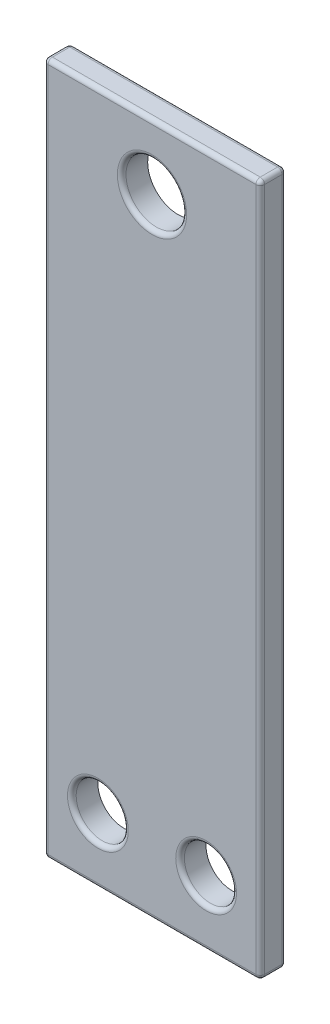
ISO-10303-21;
HEADER;
FILE_DESCRIPTION(('STEP AP214'),'2;1');
FILE_NAME('part.step','',(''),(''),'','','');
FILE_SCHEMA(('AUTOMOTIVE_DESIGN { 1 0 10303 214 1 1 1 1 }'));
ENDSEC;
DATA;
#1=APPLICATION_CONTEXT('core data for automotive mechanical design processes');
#2=APPLICATION_PROTOCOL_DEFINITION('international standard','automotive_design',2000,#1);
#3=PRODUCT_CONTEXT('',#1,'mechanical');
#4=PRODUCT('Part','Part','',(#3));
#5=PRODUCT_RELATED_PRODUCT_CATEGORY('part','',(#4));
#6=PRODUCT_DEFINITION_FORMATION('','',#4);
#7=PRODUCT_DEFINITION_CONTEXT('part definition',#1,'design');
#8=PRODUCT_DEFINITION('design','',#6,#7);
#9=PRODUCT_DEFINITION_SHAPE('','',#8);
#10=(LENGTH_UNIT() NAMED_UNIT(*) SI_UNIT(.MILLI.,.METRE.));
#11=(NAMED_UNIT(*) PLANE_ANGLE_UNIT() SI_UNIT($,.RADIAN.));
#12=(NAMED_UNIT(*) SI_UNIT($,.STERADIAN.) SOLID_ANGLE_UNIT());
#13=UNCERTAINTY_MEASURE_WITH_UNIT(LENGTH_MEASURE(1.E-05),#10,'distance_accuracy_value','');
#14=(GEOMETRIC_REPRESENTATION_CONTEXT(3) GLOBAL_UNCERTAINTY_ASSIGNED_CONTEXT((#13)) GLOBAL_UNIT_ASSIGNED_CONTEXT((#10,
#11,#12)) REPRESENTATION_CONTEXT('',''));
#15=CARTESIAN_POINT('',(0.,0.,0.));
#16=DIRECTION('',(0.,0.,1.));
#17=DIRECTION('',(1.,0.,0.));
#18=AXIS2_PLACEMENT_3D('',#15,#16,#17);
#19=CARTESIAN_POINT('',(0.,0.,3.));
#20=DIRECTION('',(0.,0.,-1.));
#21=DIRECTION('',(-1.,0.,0.));
#22=AXIS2_PLACEMENT_3D('',#19,#20,#21);
#23=PLANE('',#22);
#24=CARTESIAN_POINT('',(-6.24999999999999,-32.5,3.));
#25=DIRECTION('',(0.,0.,-1.));
#26=DIRECTION('',(-1.,0.,0.));
#27=AXIS2_PLACEMENT_3D('',#24,#25,#26);
#28=CIRCLE('',#27,3.50929202176863);
#29=CARTESIAN_POINT('',(-9.75929202176862,-32.5,3.));
#30=VERTEX_POINT('',#29);
#31=EDGE_CURVE('E273',#30,#30,#28,.T.);
#32=ORIENTED_EDGE('',*,*,#31,.T.);
#33=EDGE_LOOP('',(#32));
#34=FACE_BOUND('',#33,.T.);
#35=CARTESIAN_POINT('',(6.25,-32.5,3.));
#36=DIRECTION('',(0.,0.,-1.));
#37=DIRECTION('',(-1.,0.,0.));
#38=AXIS2_PLACEMENT_3D('',#35,#36,#37);
#39=CIRCLE('',#38,3.50929202176863);
#40=CARTESIAN_POINT('',(2.74070797823137,-32.5,3.));
#41=VERTEX_POINT('',#40);
#42=EDGE_CURVE('E271',#41,#41,#39,.T.);
#43=ORIENTED_EDGE('',*,*,#42,.T.);
#44=EDGE_LOOP('',(#43));
#45=FACE_BOUND('',#44,.T.);
#46=CARTESIAN_POINT('',(0.,32.5,3.));
#47=DIRECTION('',(0.,0.,-1.));
#48=DIRECTION('',(-1.,0.,0.));
#49=AXIS2_PLACEMENT_3D('',#46,#47,#48);
#50=CIRCLE('',#49,4.);
#51=CARTESIAN_POINT('',(-4.,32.5,3.));
#52=VERTEX_POINT('',#51);
#53=EDGE_CURVE('E268',#52,#52,#50,.T.);
#54=ORIENTED_EDGE('',*,*,#53,.T.);
#55=EDGE_LOOP('',(#54));
#56=FACE_BOUND('',#55,.T.);
#57=DIRECTION('',(0.,-1.,0.));
#58=VECTOR('',#57,1.);
#59=CARTESIAN_POINT('',(-12.,0.,3.));
#60=LINE('',#59,#58);
#61=CARTESIAN_POINT('',(-12.,39.5,3.));
#62=VERTEX_POINT('',#61);
#63=CARTESIAN_POINT('',(-12.,-39.5,3.));
#64=VERTEX_POINT('',#63);
#65=EDGE_CURVE('E57',#62,#64,#60,.T.);
#66=ORIENTED_EDGE('',*,*,#65,.T.);
#67=DIRECTION('',(1.,0.,0.));
#68=VECTOR('',#67,1.);
#69=CARTESIAN_POINT('',(0.,-39.5,3.));
#70=LINE('',#69,#68);
#71=CARTESIAN_POINT('',(12.,-39.5,3.));
#72=VERTEX_POINT('',#71);
#73=EDGE_CURVE('E266',#64,#72,#70,.T.);
#74=ORIENTED_EDGE('',*,*,#73,.T.);
#75=DIRECTION('',(0.,1.,0.));
#76=VECTOR('',#75,1.);
#77=CARTESIAN_POINT('',(12.,0.,3.));
#78=LINE('',#77,#76);
#79=CARTESIAN_POINT('',(12.,39.5,3.));
#80=VERTEX_POINT('',#79);
#81=EDGE_CURVE('E265',#72,#80,#78,.T.);
#82=ORIENTED_EDGE('',*,*,#81,.T.);
#83=DIRECTION('',(-1.,0.,0.));
#84=VECTOR('',#83,1.);
#85=CARTESIAN_POINT('',(0.,39.5,3.));
#86=LINE('',#85,#84);
#87=EDGE_CURVE('E63',#80,#62,#86,.T.);
#88=ORIENTED_EDGE('',*,*,#87,.T.);
#89=EDGE_LOOP('',(#66,#74,#82,#88));
#90=FACE_BOUND('',#89,.T.);
#91=ADVANCED_FACE('F39',(#34,#45,#56,#90),#23,.F.);
#92=CARTESIAN_POINT('',(0.,0.,0.));
#93=DIRECTION('',(0.,0.,-1.));
#94=DIRECTION('',(-1.,0.,0.));
#95=AXIS2_PLACEMENT_3D('',#92,#93,#94);
#96=PLANE('',#95);
#97=DIRECTION('',(-1.,0.,0.));
#98=VECTOR('',#97,1.);
#99=CARTESIAN_POINT('',(12.5,39.5,0.));
#100=LINE('',#99,#98);
#101=CARTESIAN_POINT('',(-12.,39.5,0.));
#102=VERTEX_POINT('',#101);
#103=CARTESIAN_POINT('',(12.,39.5,0.));
#104=VERTEX_POINT('',#103);
#105=EDGE_CURVE('E229',#102,#104,#100,.F.);
#106=ORIENTED_EDGE('',*,*,#105,.T.);
#107=DIRECTION('',(0.,1.,0.));
#108=VECTOR('',#107,1.);
#109=CARTESIAN_POINT('',(12.,-40.,0.));
#110=LINE('',#109,#108);
#111=CARTESIAN_POINT('',(12.,-39.5,0.));
#112=VERTEX_POINT('',#111);
#113=EDGE_CURVE('E231',#104,#112,#110,.F.);
#114=ORIENTED_EDGE('',*,*,#113,.T.);
#115=DIRECTION('',(1.,0.,0.));
#116=VECTOR('',#115,1.);
#117=CARTESIAN_POINT('',(-12.5,-39.5,0.));
#118=LINE('',#117,#116);
#119=CARTESIAN_POINT('',(-12.,-39.5,0.));
#120=VERTEX_POINT('',#119);
#121=EDGE_CURVE('E230',#112,#120,#118,.F.);
#122=ORIENTED_EDGE('',*,*,#121,.T.);
#123=DIRECTION('',(0.,-1.,0.));
#124=VECTOR('',#123,1.);
#125=CARTESIAN_POINT('',(-12.,40.,0.));
#126=LINE('',#125,#124);
#127=EDGE_CURVE('E223',#120,#102,#126,.F.);
#128=ORIENTED_EDGE('',*,*,#127,.T.);
#129=EDGE_LOOP('',(#106,#114,#122,#128));
#130=FACE_BOUND('',#129,.T.);
#131=CARTESIAN_POINT('',(6.25,-32.5,0.));
#132=DIRECTION('',(0.,0.,1.));
#133=DIRECTION('',(1.,0.,0.));
#134=AXIS2_PLACEMENT_3D('',#131,#132,#133);
#135=CIRCLE('',#134,3.00929202176863);
#136=CARTESIAN_POINT('',(9.25929202176864,-32.5,0.));
#137=VERTEX_POINT('',#136);
#138=EDGE_CURVE('E212',#137,#137,#135,.T.);
#139=ORIENTED_EDGE('',*,*,#138,.T.);
#140=EDGE_LOOP('',(#139));
#141=FACE_BOUND('',#140,.T.);
#142=CARTESIAN_POINT('',(0.,32.5,0.));
#143=DIRECTION('',(0.,0.,1.));
#144=DIRECTION('',(1.,0.,0.));
#145=AXIS2_PLACEMENT_3D('',#142,#143,#144);
#146=CIRCLE('',#145,3.5);
#147=CARTESIAN_POINT('',(3.5,32.5,0.));
#148=VERTEX_POINT('',#147);
#149=EDGE_CURVE('E147',#148,#148,#146,.T.);
#150=ORIENTED_EDGE('',*,*,#149,.T.);
#151=EDGE_LOOP('',(#150));
#152=FACE_BOUND('',#151,.T.);
#153=CARTESIAN_POINT('',(-6.24999999999999,-32.5,0.));
#154=DIRECTION('',(0.,0.,1.));
#155=DIRECTION('',(-1.,0.,0.));
#156=AXIS2_PLACEMENT_3D('',#153,#154,#155);
#157=CIRCLE('',#156,3.00929202176863);
#158=CARTESIAN_POINT('',(-9.25929202176862,-32.5,0.));
#159=VERTEX_POINT('',#158);
#160=EDGE_CURVE('E207',#159,#159,#157,.T.);
#161=ORIENTED_EDGE('',*,*,#160,.T.);
#162=EDGE_LOOP('',(#161));
#163=FACE_BOUND('',#162,.T.);
#164=ADVANCED_FACE('F303',(#130,#141,#152,#163),#96,.T.);
#165=CARTESIAN_POINT('',(12.5,-40.,3.));
#166=DIRECTION('',(-1.,0.,0.));
#167=DIRECTION('',(0.,-1.,0.));
#168=AXIS2_PLACEMENT_3D('',#165,#166,#167);
#169=PLANE('',#168);
#170=DIRECTION('',(0.,0.,-1.));
#171=VECTOR('',#170,1.);
#172=CARTESIAN_POINT('',(12.5,-39.5,3.));
#173=LINE('',#172,#171);
#174=CARTESIAN_POINT('',(12.5,-39.5,2.5));
#175=VERTEX_POINT('',#174);
#176=CARTESIAN_POINT('',(12.5,-39.5,0.5));
#177=VERTEX_POINT('',#176);
#178=EDGE_CURVE('E138',#175,#177,#173,.T.);
#179=ORIENTED_EDGE('',*,*,#178,.T.);
#180=DIRECTION('',(0.,1.,0.));
#181=VECTOR('',#180,1.);
#182=CARTESIAN_POINT('',(12.5,40.,0.5));
#183=LINE('',#182,#181);
#184=CARTESIAN_POINT('',(12.5,39.5,0.5));
#185=VERTEX_POINT('',#184);
#186=EDGE_CURVE('E131',#177,#185,#183,.T.);
#187=ORIENTED_EDGE('',*,*,#186,.T.);
#188=DIRECTION('',(0.,0.,-1.));
#189=VECTOR('',#188,1.);
#190=CARTESIAN_POINT('',(12.5,39.5,3.));
#191=LINE('',#190,#189);
#192=CARTESIAN_POINT('',(12.5,39.5,2.5));
#193=VERTEX_POINT('',#192);
#194=EDGE_CURVE('E129',#185,#193,#191,.F.);
#195=ORIENTED_EDGE('',*,*,#194,.T.);
#196=DIRECTION('',(0.,1.,0.));
#197=VECTOR('',#196,1.);
#198=CARTESIAN_POINT('',(12.5,-40.,2.5));
#199=LINE('',#198,#197);
#200=EDGE_CURVE('E134',#193,#175,#199,.F.);
#201=ORIENTED_EDGE('',*,*,#200,.T.);
#202=EDGE_LOOP('',(#179,#187,#195,#201));
#203=FACE_BOUND('',#202,.T.);
#204=ADVANCED_FACE('F133',(#203),#169,.F.);
#205=CARTESIAN_POINT('',(-12.5,40.,3.));
#206=DIRECTION('',(0.,-1.,0.));
#207=DIRECTION('',(0.,0.,-1.));
#208=AXIS2_PLACEMENT_3D('',#205,#206,#207);
#209=PLANE('',#208);
#210=DIRECTION('',(-1.,0.,0.));
#211=VECTOR('',#210,1.);
#212=CARTESIAN_POINT('',(-12.5,40.,2.5));
#213=LINE('',#212,#211);
#214=CARTESIAN_POINT('',(-12.,40.,2.5));
#215=VERTEX_POINT('',#214);
#216=CARTESIAN_POINT('',(12.,40.,2.5));
#217=VERTEX_POINT('',#216);
#218=EDGE_CURVE('E242',#215,#217,#213,.F.);
#219=ORIENTED_EDGE('',*,*,#218,.T.);
#220=DIRECTION('',(0.,0.,-1.));
#221=VECTOR('',#220,1.);
#222=CARTESIAN_POINT('',(12.,40.,3.));
#223=LINE('',#222,#221);
#224=CARTESIAN_POINT('',(12.,40.,0.5));
#225=VERTEX_POINT('',#224);
#226=EDGE_CURVE('E165',#217,#225,#223,.T.);
#227=ORIENTED_EDGE('',*,*,#226,.T.);
#228=DIRECTION('',(-1.,0.,0.));
#229=VECTOR('',#228,1.);
#230=CARTESIAN_POINT('',(-12.5,40.,0.5));
#231=LINE('',#230,#229);
#232=CARTESIAN_POINT('',(-12.,40.,0.5));
#233=VERTEX_POINT('',#232);
#234=EDGE_CURVE('E247',#225,#233,#231,.T.);
#235=ORIENTED_EDGE('',*,*,#234,.T.);
#236=DIRECTION('',(0.,0.,-1.));
#237=VECTOR('',#236,1.);
#238=CARTESIAN_POINT('',(-12.,40.,3.));
#239=LINE('',#238,#237);
#240=EDGE_CURVE('E241',#233,#215,#239,.F.);
#241=ORIENTED_EDGE('',*,*,#240,.T.);
#242=EDGE_LOOP('',(#219,#227,#235,#241));
#243=FACE_BOUND('',#242,.T.);
#244=ADVANCED_FACE('F317',(#243),#209,.F.);
#245=CARTESIAN_POINT('',(-12.5,-40.,3.));
#246=DIRECTION('',(1.,0.,0.));
#247=DIRECTION('',(0.,1.,0.));
#248=AXIS2_PLACEMENT_3D('',#245,#246,#247);
#249=PLANE('',#248);
#250=DIRECTION('',(0.,0.,-1.));
#251=VECTOR('',#250,1.);
#252=CARTESIAN_POINT('',(-12.5,39.5,3.));
#253=LINE('',#252,#251);
#254=CARTESIAN_POINT('',(-12.5,39.5,2.5));
#255=VERTEX_POINT('',#254);
#256=CARTESIAN_POINT('',(-12.5,39.5,0.5));
#257=VERTEX_POINT('',#256);
#258=EDGE_CURVE('E255',#255,#257,#253,.T.);
#259=ORIENTED_EDGE('',*,*,#258,.T.);
#260=DIRECTION('',(0.,-1.,0.));
#261=VECTOR('',#260,1.);
#262=CARTESIAN_POINT('',(-12.5,-40.,0.5));
#263=LINE('',#262,#261);
#264=CARTESIAN_POINT('',(-12.5,-39.5,0.5));
#265=VERTEX_POINT('',#264);
#266=EDGE_CURVE('E260',#257,#265,#263,.T.);
#267=ORIENTED_EDGE('',*,*,#266,.T.);
#268=DIRECTION('',(0.,0.,-1.));
#269=VECTOR('',#268,1.);
#270=CARTESIAN_POINT('',(-12.5,-39.5,3.));
#271=LINE('',#270,#269);
#272=CARTESIAN_POINT('',(-12.5,-39.5,2.5));
#273=VERTEX_POINT('',#272);
#274=EDGE_CURVE('E252',#265,#273,#271,.F.);
#275=ORIENTED_EDGE('',*,*,#274,.T.);
#276=DIRECTION('',(0.,-1.,0.));
#277=VECTOR('',#276,1.);
#278=CARTESIAN_POINT('',(-12.5,-40.,2.5));
#279=LINE('',#278,#277);
#280=EDGE_CURVE('E250',#273,#255,#279,.F.);
#281=ORIENTED_EDGE('',*,*,#280,.T.);
#282=EDGE_LOOP('',(#259,#267,#275,#281));
#283=FACE_BOUND('',#282,.T.);
#284=ADVANCED_FACE('F329',(#283),#249,.F.);
#285=CARTESIAN_POINT('',(-12.5,-40.,3.));
#286=DIRECTION('',(0.,1.,0.));
#287=DIRECTION('',(0.,0.,1.));
#288=AXIS2_PLACEMENT_3D('',#285,#286,#287);
#289=PLANE('',#288);
#290=DIRECTION('',(1.,0.,0.));
#291=VECTOR('',#290,1.);
#292=CARTESIAN_POINT('',(12.5,-40.,0.5));
#293=LINE('',#292,#291);
#294=CARTESIAN_POINT('',(-12.,-40.,0.5));
#295=VERTEX_POINT('',#294);
#296=CARTESIAN_POINT('',(12.,-40.,0.5));
#297=VERTEX_POINT('',#296);
#298=EDGE_CURVE('E236',#295,#297,#293,.T.);
#299=ORIENTED_EDGE('',*,*,#298,.T.);
#300=DIRECTION('',(0.,0.,-1.));
#301=VECTOR('',#300,1.);
#302=CARTESIAN_POINT('',(12.,-40.,3.));
#303=LINE('',#302,#301);
#304=CARTESIAN_POINT('',(12.,-40.,2.5));
#305=VERTEX_POINT('',#304);
#306=EDGE_CURVE('E238',#297,#305,#303,.F.);
#307=ORIENTED_EDGE('',*,*,#306,.T.);
#308=DIRECTION('',(1.,0.,0.));
#309=VECTOR('',#308,1.);
#310=CARTESIAN_POINT('',(-12.5,-40.,2.5));
#311=LINE('',#310,#309);
#312=CARTESIAN_POINT('',(-12.,-40.,2.5));
#313=VERTEX_POINT('',#312);
#314=EDGE_CURVE('E233',#305,#313,#311,.F.);
#315=ORIENTED_EDGE('',*,*,#314,.T.);
#316=DIRECTION('',(0.,0.,-1.));
#317=VECTOR('',#316,1.);
#318=CARTESIAN_POINT('',(-12.,-40.,3.));
#319=LINE('',#318,#317);
#320=EDGE_CURVE('E237',#313,#295,#319,.T.);
#321=ORIENTED_EDGE('',*,*,#320,.T.);
#322=EDGE_LOOP('',(#299,#307,#315,#321));
#323=FACE_BOUND('',#322,.T.);
#324=ADVANCED_FACE('F355',(#323),#289,.F.);
#325=CARTESIAN_POINT('',(0.,32.5,3.));
#326=DIRECTION('',(0.,0.,-1.));
#327=DIRECTION('',(-1.,0.,0.));
#328=AXIS2_PLACEMENT_3D('',#325,#326,#327);
#329=CYLINDRICAL_SURFACE('',#328,3.5);
#330=CARTESIAN_POINT('',(0.,32.5,2.5));
#331=DIRECTION('',(0.,0.,-1.));
#332=DIRECTION('',(-1.,0.,0.));
#333=AXIS2_PLACEMENT_3D('',#330,#331,#332);
#334=CIRCLE('',#333,3.5);
#335=CARTESIAN_POINT('',(-3.5,32.5,2.5));
#336=VERTEX_POINT('',#335);
#337=EDGE_CURVE('E11',#336,#336,#334,.F.);
#338=ORIENTED_EDGE('',*,*,#337,.T.);
#339=EDGE_LOOP('',(#338));
#340=FACE_BOUND('',#339,.T.);
#341=ORIENTED_EDGE('',*,*,#149,.F.);
#342=EDGE_LOOP('',(#341));
#343=FACE_BOUND('',#342,.T.);
#344=ADVANCED_FACE('F353',(#340,#343),#329,.F.);
#345=CARTESIAN_POINT('',(6.25,-32.5,3.));
#346=DIRECTION('',(0.,0.,-1.));
#347=DIRECTION('',(-1.,0.,0.));
#348=AXIS2_PLACEMENT_3D('',#345,#346,#347);
#349=CYLINDRICAL_SURFACE('',#348,3.00929202176863);
#350=CARTESIAN_POINT('',(6.25,-32.5,2.5));
#351=DIRECTION('',(0.,0.,-1.));
#352=DIRECTION('',(-1.,0.,0.));
#353=AXIS2_PLACEMENT_3D('',#350,#351,#352);
#354=CIRCLE('',#353,3.00929202176863);
#355=CARTESIAN_POINT('',(3.24070797823137,-32.5,2.5));
#356=VERTEX_POINT('',#355);
#357=EDGE_CURVE('E48',#356,#356,#354,.F.);
#358=ORIENTED_EDGE('',*,*,#357,.T.);
#359=EDGE_LOOP('',(#358));
#360=FACE_BOUND('',#359,.T.);
#361=ORIENTED_EDGE('',*,*,#138,.F.);
#362=EDGE_LOOP('',(#361));
#363=FACE_BOUND('',#362,.T.);
#364=ADVANCED_FACE('F431',(#360,#363),#349,.F.);
#365=CARTESIAN_POINT('',(-6.24999999999999,-32.5,3.));
#366=DIRECTION('',(0.,0.,-1.));
#367=DIRECTION('',(-1.,0.,0.));
#368=AXIS2_PLACEMENT_3D('',#365,#366,#367);
#369=CYLINDRICAL_SURFACE('',#368,3.00929202176863);
#370=CARTESIAN_POINT('',(-6.24999999999999,-32.5,2.5));
#371=DIRECTION('',(0.,0.,-1.));
#372=DIRECTION('',(-1.,0.,0.));
#373=AXIS2_PLACEMENT_3D('',#370,#371,#372);
#374=CIRCLE('',#373,3.00929202176863);
#375=CARTESIAN_POINT('',(-9.25929202176862,-32.5,2.5));
#376=VERTEX_POINT('',#375);
#377=EDGE_CURVE('E259',#376,#376,#374,.F.);
#378=ORIENTED_EDGE('',*,*,#377,.T.);
#379=EDGE_LOOP('',(#378));
#380=FACE_BOUND('',#379,.T.);
#381=ORIENTED_EDGE('',*,*,#160,.F.);
#382=EDGE_LOOP('',(#381));
#383=FACE_BOUND('',#382,.T.);
#384=ADVANCED_FACE('F417',(#380,#383),#369,.F.);
#385=CARTESIAN_POINT('',(-12.,0.,2.5));
#386=DIRECTION('',(0.,-1.,0.));
#387=DIRECTION('',(1.,0.,0.));
#388=AXIS2_PLACEMENT_3D('',#385,#386,#387);
#389=CYLINDRICAL_SURFACE('',#388,0.5);
#390=CARTESIAN_POINT('',(-12.,-39.5,2.5));
#391=DIRECTION('',(0.,-1.,0.));
#392=DIRECTION('',(0.,0.,-1.));
#393=AXIS2_PLACEMENT_3D('',#390,#391,#392);
#394=CIRCLE('',#393,0.5);
#395=EDGE_CURVE('E43',#64,#273,#394,.T.);
#396=ORIENTED_EDGE('',*,*,#395,.F.);
#397=ORIENTED_EDGE('',*,*,#65,.F.);
#398=CARTESIAN_POINT('',(-12.,39.5,2.5));
#399=DIRECTION('',(0.,1.,0.));
#400=DIRECTION('',(0.,0.,1.));
#401=AXIS2_PLACEMENT_3D('',#398,#399,#400);
#402=CIRCLE('',#401,0.5);
#403=EDGE_CURVE('E205',#255,#62,#402,.T.);
#404=ORIENTED_EDGE('',*,*,#403,.F.);
#405=ORIENTED_EDGE('',*,*,#280,.F.);
#406=EDGE_LOOP('',(#396,#397,#404,#405));
#407=FACE_BOUND('',#406,.T.);
#408=ADVANCED_FACE('F331',(#407),#389,.T.);
#409=CARTESIAN_POINT('',(-12.,-39.5,2.5));
#410=DIRECTION('',(-1.,0.,0.));
#411=DIRECTION('',(0.,0.,1.));
#412=AXIS2_PLACEMENT_3D('',#409,#410,#411);
#413=SPHERICAL_SURFACE('',#412,0.5);
#414=CARTESIAN_POINT('',(-12.,-39.5,2.5));
#415=DIRECTION('',(-1.,0.,0.));
#416=DIRECTION('',(0.,0.,1.));
#417=AXIS2_PLACEMENT_3D('',#414,#415,#416);
#418=CIRCLE('',#417,0.5);
#419=EDGE_CURVE('E197',#64,#313,#418,.F.);
#420=ORIENTED_EDGE('',*,*,#419,.F.);
#421=ORIENTED_EDGE('',*,*,#395,.T.);
#422=CARTESIAN_POINT('',(-12.,-39.5,2.5));
#423=DIRECTION('',(0.,0.,1.));
#424=DIRECTION('',(1.,0.,0.));
#425=AXIS2_PLACEMENT_3D('',#422,#423,#424);
#426=CIRCLE('',#425,0.5);
#427=EDGE_CURVE('E199',#313,#273,#426,.F.);
#428=ORIENTED_EDGE('',*,*,#427,.F.);
#429=EDGE_LOOP('',(#420,#421,#428));
#430=FACE_BOUND('',#429,.T.);
#431=ADVANCED_FACE('F338',(#430),#413,.T.);
#432=CARTESIAN_POINT('',(-12.,39.5,2.5));
#433=DIRECTION('',(0.,0.,1.));
#434=DIRECTION('',(1.,0.,0.));
#435=AXIS2_PLACEMENT_3D('',#432,#433,#434);
#436=SPHERICAL_SURFACE('',#435,0.5);
#437=CARTESIAN_POINT('',(-12.,39.5,2.5));
#438=DIRECTION('',(0.,0.,1.));
#439=DIRECTION('',(1.,0.,0.));
#440=AXIS2_PLACEMENT_3D('',#437,#438,#439);
#441=CIRCLE('',#440,0.5);
#442=EDGE_CURVE('E191',#255,#215,#441,.F.);
#443=ORIENTED_EDGE('',*,*,#442,.F.);
#444=ORIENTED_EDGE('',*,*,#403,.T.);
#445=CARTESIAN_POINT('',(-12.,39.5,2.5));
#446=DIRECTION('',(-1.,0.,0.));
#447=DIRECTION('',(0.,0.,1.));
#448=AXIS2_PLACEMENT_3D('',#445,#446,#447);
#449=CIRCLE('',#448,0.5);
#450=EDGE_CURVE('E193',#215,#62,#449,.F.);
#451=ORIENTED_EDGE('',*,*,#450,.F.);
#452=EDGE_LOOP('',(#443,#444,#451));
#453=FACE_BOUND('',#452,.T.);
#454=ADVANCED_FACE('F323',(#453),#436,.T.);
#455=CARTESIAN_POINT('',(-12.,-39.5,3.));
#456=DIRECTION('',(0.,0.,-1.));
#457=DIRECTION('',(-1.,0.,0.));
#458=AXIS2_PLACEMENT_3D('',#455,#456,#457);
#459=CYLINDRICAL_SURFACE('',#458,0.5);
#460=ORIENTED_EDGE('',*,*,#427,.T.);
#461=ORIENTED_EDGE('',*,*,#274,.F.);
#462=CARTESIAN_POINT('',(-12.,-39.5,0.5));
#463=DIRECTION('',(0.,0.,-1.));
#464=DIRECTION('',(-1.,0.,0.));
#465=AXIS2_PLACEMENT_3D('',#462,#463,#464);
#466=CIRCLE('',#465,0.5);
#467=EDGE_CURVE('E183',#295,#265,#466,.T.);
#468=ORIENTED_EDGE('',*,*,#467,.F.);
#469=ORIENTED_EDGE('',*,*,#320,.F.);
#470=EDGE_LOOP('',(#460,#461,#468,#469));
#471=FACE_BOUND('',#470,.T.);
#472=ADVANCED_FACE('F409',(#471),#459,.T.);
#473=CARTESIAN_POINT('',(0.,-39.5,2.5));
#474=DIRECTION('',(1.,0.,0.));
#475=DIRECTION('',(0.,0.,-1.));
#476=AXIS2_PLACEMENT_3D('',#473,#474,#475);
#477=CYLINDRICAL_SURFACE('',#476,0.5);
#478=ORIENTED_EDGE('',*,*,#419,.T.);
#479=ORIENTED_EDGE('',*,*,#314,.F.);
#480=CARTESIAN_POINT('',(12.,-39.5,2.5));
#481=DIRECTION('',(1.,0.,0.));
#482=DIRECTION('',(0.,0.,-1.));
#483=AXIS2_PLACEMENT_3D('',#480,#481,#482);
#484=CIRCLE('',#483,0.5);
#485=EDGE_CURVE('E185',#72,#305,#484,.T.);
#486=ORIENTED_EDGE('',*,*,#485,.F.);
#487=ORIENTED_EDGE('',*,*,#73,.F.);
#488=EDGE_LOOP('',(#478,#479,#486,#487));
#489=FACE_BOUND('',#488,.T.);
#490=ADVANCED_FACE('F341',(#489),#477,.T.);
#491=CARTESIAN_POINT('',(12.,0.,2.5));
#492=DIRECTION('',(0.,1.,0.));
#493=DIRECTION('',(-1.,0.,0.));
#494=AXIS2_PLACEMENT_3D('',#491,#492,#493);
#495=CYLINDRICAL_SURFACE('',#494,0.5);
#496=CARTESIAN_POINT('',(12.,39.5,2.5));
#497=DIRECTION('',(0.,1.,0.));
#498=DIRECTION('',(0.,0.,1.));
#499=AXIS2_PLACEMENT_3D('',#496,#497,#498);
#500=CIRCLE('',#499,0.5);
#501=EDGE_CURVE('E148',#80,#193,#500,.T.);
#502=ORIENTED_EDGE('',*,*,#501,.F.);
#503=ORIENTED_EDGE('',*,*,#81,.F.);
#504=CARTESIAN_POINT('',(12.,-39.5,2.5));
#505=DIRECTION('',(0.,-1.,0.));
#506=DIRECTION('',(0.,0.,-1.));
#507=AXIS2_PLACEMENT_3D('',#504,#505,#506);
#508=CIRCLE('',#507,0.5);
#509=EDGE_CURVE('E146',#175,#72,#508,.T.);
#510=ORIENTED_EDGE('',*,*,#509,.F.);
#511=ORIENTED_EDGE('',*,*,#200,.F.);
#512=EDGE_LOOP('',(#502,#503,#510,#511));
#513=FACE_BOUND('',#512,.T.);
#514=ADVANCED_FACE('F145',(#513),#495,.T.);
#515=CARTESIAN_POINT('',(0.,39.5,2.5));
#516=DIRECTION('',(-1.,0.,0.));
#517=DIRECTION('',(0.,0.,1.));
#518=AXIS2_PLACEMENT_3D('',#515,#516,#517);
#519=CYLINDRICAL_SURFACE('',#518,0.5);
#520=ORIENTED_EDGE('',*,*,#450,.T.);
#521=ORIENTED_EDGE('',*,*,#87,.F.);
#522=CARTESIAN_POINT('',(12.,39.5,2.5));
#523=DIRECTION('',(1.,0.,0.));
#524=DIRECTION('',(0.,0.,-1.));
#525=AXIS2_PLACEMENT_3D('',#522,#523,#524);
#526=CIRCLE('',#525,0.5);
#527=EDGE_CURVE('E158',#217,#80,#526,.T.);
#528=ORIENTED_EDGE('',*,*,#527,.F.);
#529=ORIENTED_EDGE('',*,*,#218,.F.);
#530=EDGE_LOOP('',(#520,#521,#528,#529));
#531=FACE_BOUND('',#530,.T.);
#532=ADVANCED_FACE('F325',(#531),#519,.T.);
#533=CARTESIAN_POINT('',(-12.,39.5,3.));
#534=DIRECTION('',(0.,0.,-1.));
#535=DIRECTION('',(-1.,0.,0.));
#536=AXIS2_PLACEMENT_3D('',#533,#534,#535);
#537=CYLINDRICAL_SURFACE('',#536,0.5);
#538=ORIENTED_EDGE('',*,*,#442,.T.);
#539=ORIENTED_EDGE('',*,*,#240,.F.);
#540=CARTESIAN_POINT('',(-12.,39.5,0.5));
#541=DIRECTION('',(0.,0.,-1.));
#542=DIRECTION('',(-1.,0.,0.));
#543=AXIS2_PLACEMENT_3D('',#540,#541,#542);
#544=CIRCLE('',#543,0.5);
#545=EDGE_CURVE('E177',#257,#233,#544,.T.);
#546=ORIENTED_EDGE('',*,*,#545,.F.);
#547=ORIENTED_EDGE('',*,*,#258,.F.);
#548=EDGE_LOOP('',(#538,#539,#546,#547));
#549=FACE_BOUND('',#548,.T.);
#550=ADVANCED_FACE('F330',(#549),#537,.T.);
#551=CARTESIAN_POINT('',(-12.,-40.,0.5));
#552=DIRECTION('',(0.,1.,0.));
#553=DIRECTION('',(-1.,0.,0.));
#554=AXIS2_PLACEMENT_3D('',#551,#552,#553);
#555=CYLINDRICAL_SURFACE('',#554,0.5);
#556=CARTESIAN_POINT('',(-12.,-39.5,0.5));
#557=DIRECTION('',(0.,-1.,0.));
#558=DIRECTION('',(0.,0.,-1.));
#559=AXIS2_PLACEMENT_3D('',#556,#557,#558);
#560=CIRCLE('',#559,0.5);
#561=EDGE_CURVE('E187',#265,#120,#560,.T.);
#562=ORIENTED_EDGE('',*,*,#561,.F.);
#563=ORIENTED_EDGE('',*,*,#266,.F.);
#564=CARTESIAN_POINT('',(-12.,39.5,0.5));
#565=DIRECTION('',(0.,1.,0.));
#566=DIRECTION('',(0.,0.,1.));
#567=AXIS2_PLACEMENT_3D('',#564,#565,#566);
#568=CIRCLE('',#567,0.5);
#569=EDGE_CURVE('E171',#102,#257,#568,.T.);
#570=ORIENTED_EDGE('',*,*,#569,.F.);
#571=ORIENTED_EDGE('',*,*,#127,.F.);
#572=EDGE_LOOP('',(#562,#563,#570,#571));
#573=FACE_BOUND('',#572,.T.);
#574=ADVANCED_FACE('F395',(#573),#555,.T.);
#575=CARTESIAN_POINT('',(-12.,-39.5,0.5));
#576=DIRECTION('',(-1.,0.,0.));
#577=DIRECTION('',(0.,0.,1.));
#578=AXIS2_PLACEMENT_3D('',#575,#576,#577);
#579=SPHERICAL_SURFACE('',#578,0.5);
#580=ORIENTED_EDGE('',*,*,#467,.T.);
#581=ORIENTED_EDGE('',*,*,#561,.T.);
#582=CARTESIAN_POINT('',(-12.,-39.5,0.5));
#583=DIRECTION('',(-1.,0.,0.));
#584=DIRECTION('',(0.,0.,1.));
#585=AXIS2_PLACEMENT_3D('',#582,#583,#584);
#586=CIRCLE('',#585,0.5);
#587=EDGE_CURVE('E167',#295,#120,#586,.F.);
#588=ORIENTED_EDGE('',*,*,#587,.F.);
#589=EDGE_LOOP('',(#580,#581,#588));
#590=FACE_BOUND('',#589,.T.);
#591=ADVANCED_FACE('F388',(#590),#579,.T.);
#592=CARTESIAN_POINT('',(12.,-39.5,2.5));
#593=DIRECTION('',(0.,0.,1.));
#594=DIRECTION('',(1.,0.,0.));
#595=AXIS2_PLACEMENT_3D('',#592,#593,#594);
#596=SPHERICAL_SURFACE('',#595,0.5);
#597=ORIENTED_EDGE('',*,*,#509,.T.);
#598=ORIENTED_EDGE('',*,*,#485,.T.);
#599=CARTESIAN_POINT('',(12.,-39.5,2.5));
#600=DIRECTION('',(0.,0.,1.));
#601=DIRECTION('',(1.,0.,0.));
#602=AXIS2_PLACEMENT_3D('',#599,#600,#601);
#603=CIRCLE('',#602,0.5);
#604=EDGE_CURVE('E162',#175,#305,#603,.F.);
#605=ORIENTED_EDGE('',*,*,#604,.F.);
#606=EDGE_LOOP('',(#597,#598,#605));
#607=FACE_BOUND('',#606,.T.);
#608=ADVANCED_FACE('F390',(#607),#596,.T.);
#609=CARTESIAN_POINT('',(12.,39.5,2.5));
#610=DIRECTION('',(0.,0.,1.));
#611=DIRECTION('',(1.,0.,0.));
#612=AXIS2_PLACEMENT_3D('',#609,#610,#611);
#613=SPHERICAL_SURFACE('',#612,0.5);
#614=ORIENTED_EDGE('',*,*,#527,.T.);
#615=ORIENTED_EDGE('',*,*,#501,.T.);
#616=CARTESIAN_POINT('',(12.,39.5,2.5));
#617=DIRECTION('',(0.,0.,1.));
#618=DIRECTION('',(1.,0.,0.));
#619=AXIS2_PLACEMENT_3D('',#616,#617,#618);
#620=CIRCLE('',#619,0.5);
#621=EDGE_CURVE('E154',#217,#193,#620,.F.);
#622=ORIENTED_EDGE('',*,*,#621,.F.);
#623=EDGE_LOOP('',(#614,#615,#622));
#624=FACE_BOUND('',#623,.T.);
#625=ADVANCED_FACE('F152',(#624),#613,.T.);
#626=CARTESIAN_POINT('',(-12.,39.5,0.5));
#627=DIRECTION('',(-1.,0.,0.));
#628=DIRECTION('',(0.,0.,1.));
#629=AXIS2_PLACEMENT_3D('',#626,#627,#628);
#630=SPHERICAL_SURFACE('',#629,0.5);
#631=ORIENTED_EDGE('',*,*,#569,.T.);
#632=ORIENTED_EDGE('',*,*,#545,.T.);
#633=CARTESIAN_POINT('',(-12.,39.5,0.5));
#634=DIRECTION('',(-1.,0.,0.));
#635=DIRECTION('',(0.,0.,1.));
#636=AXIS2_PLACEMENT_3D('',#633,#634,#635);
#637=CIRCLE('',#636,0.5);
#638=EDGE_CURVE('E163',#102,#233,#637,.F.);
#639=ORIENTED_EDGE('',*,*,#638,.F.);
#640=EDGE_LOOP('',(#631,#632,#639));
#641=FACE_BOUND('',#640,.T.);
#642=ADVANCED_FACE('F381',(#641),#630,.T.);
#643=CARTESIAN_POINT('',(-12.5,-39.5,0.5));
#644=DIRECTION('',(-1.,0.,0.));
#645=DIRECTION('',(0.,0.,1.));
#646=AXIS2_PLACEMENT_3D('',#643,#644,#645);
#647=CYLINDRICAL_SURFACE('',#646,0.5);
#648=ORIENTED_EDGE('',*,*,#587,.T.);
#649=ORIENTED_EDGE('',*,*,#121,.F.);
#650=CARTESIAN_POINT('',(12.,-39.5,0.5));
#651=DIRECTION('',(1.,0.,0.));
#652=DIRECTION('',(0.,0.,-1.));
#653=AXIS2_PLACEMENT_3D('',#650,#651,#652);
#654=CIRCLE('',#653,0.5);
#655=EDGE_CURVE('E166',#297,#112,#654,.T.);
#656=ORIENTED_EDGE('',*,*,#655,.F.);
#657=ORIENTED_EDGE('',*,*,#298,.F.);
#658=EDGE_LOOP('',(#648,#649,#656,#657));
#659=FACE_BOUND('',#658,.T.);
#660=ADVANCED_FACE('F300',(#659),#647,.T.);
#661=CARTESIAN_POINT('',(12.,-39.5,3.));
#662=DIRECTION('',(0.,0.,-1.));
#663=DIRECTION('',(-1.,0.,0.));
#664=AXIS2_PLACEMENT_3D('',#661,#662,#663);
#665=CYLINDRICAL_SURFACE('',#664,0.5);
#666=ORIENTED_EDGE('',*,*,#604,.T.);
#667=ORIENTED_EDGE('',*,*,#306,.F.);
#668=CARTESIAN_POINT('',(12.,-39.5,0.5));
#669=DIRECTION('',(0.,0.,-1.));
#670=DIRECTION('',(-1.,0.,0.));
#671=AXIS2_PLACEMENT_3D('',#668,#669,#670);
#672=CIRCLE('',#671,0.5);
#673=EDGE_CURVE('E289',#177,#297,#672,.T.);
#674=ORIENTED_EDGE('',*,*,#673,.F.);
#675=ORIENTED_EDGE('',*,*,#178,.F.);
#676=EDGE_LOOP('',(#666,#667,#674,#675));
#677=FACE_BOUND('',#676,.T.);
#678=ADVANCED_FACE('F374',(#677),#665,.T.);
#679=CARTESIAN_POINT('',(12.,39.5,3.));
#680=DIRECTION('',(0.,0.,-1.));
#681=DIRECTION('',(-1.,0.,0.));
#682=AXIS2_PLACEMENT_3D('',#679,#680,#681);
#683=CYLINDRICAL_SURFACE('',#682,0.5);
#684=ORIENTED_EDGE('',*,*,#621,.T.);
#685=ORIENTED_EDGE('',*,*,#194,.F.);
#686=CARTESIAN_POINT('',(12.,39.5,0.5));
#687=DIRECTION('',(0.,0.,-1.));
#688=DIRECTION('',(-1.,0.,0.));
#689=AXIS2_PLACEMENT_3D('',#686,#687,#688);
#690=CIRCLE('',#689,0.5);
#691=EDGE_CURVE('E281',#225,#185,#690,.T.);
#692=ORIENTED_EDGE('',*,*,#691,.F.);
#693=ORIENTED_EDGE('',*,*,#226,.F.);
#694=EDGE_LOOP('',(#684,#685,#692,#693));
#695=FACE_BOUND('',#694,.T.);
#696=ADVANCED_FACE('F159',(#695),#683,.T.);
#697=CARTESIAN_POINT('',(-12.5,39.5,0.5));
#698=DIRECTION('',(1.,0.,0.));
#699=DIRECTION('',(0.,0.,-1.));
#700=AXIS2_PLACEMENT_3D('',#697,#698,#699);
#701=CYLINDRICAL_SURFACE('',#700,0.5);
#702=ORIENTED_EDGE('',*,*,#638,.T.);
#703=ORIENTED_EDGE('',*,*,#234,.F.);
#704=CARTESIAN_POINT('',(12.,39.5,0.5));
#705=DIRECTION('',(1.,0.,0.));
#706=DIRECTION('',(0.,1.,0.));
#707=AXIS2_PLACEMENT_3D('',#704,#705,#706);
#708=CIRCLE('',#707,0.5);
#709=EDGE_CURVE('E282',#104,#225,#708,.T.);
#710=ORIENTED_EDGE('',*,*,#709,.F.);
#711=ORIENTED_EDGE('',*,*,#105,.F.);
#712=EDGE_LOOP('',(#702,#703,#710,#711));
#713=FACE_BOUND('',#712,.T.);
#714=ADVANCED_FACE('F312',(#713),#701,.T.);
#715=CARTESIAN_POINT('',(12.,-39.5,0.5));
#716=DIRECTION('',(0.,-1.,0.));
#717=DIRECTION('',(0.,0.,-1.));
#718=AXIS2_PLACEMENT_3D('',#715,#716,#717);
#719=SPHERICAL_SURFACE('',#718,0.5);
#720=ORIENTED_EDGE('',*,*,#673,.T.);
#721=ORIENTED_EDGE('',*,*,#655,.T.);
#722=CARTESIAN_POINT('',(12.,-39.5,0.5));
#723=DIRECTION('',(0.,-1.,0.));
#724=DIRECTION('',(0.,0.,-1.));
#725=AXIS2_PLACEMENT_3D('',#722,#723,#724);
#726=CIRCLE('',#725,0.5);
#727=EDGE_CURVE('E283',#177,#112,#726,.F.);
#728=ORIENTED_EDGE('',*,*,#727,.F.);
#729=EDGE_LOOP('',(#720,#721,#728));
#730=FACE_BOUND('',#729,.T.);
#731=ADVANCED_FACE('F293',(#730),#719,.T.);
#732=CARTESIAN_POINT('',(12.,39.5,0.5));
#733=DIRECTION('',(0.,1.,0.));
#734=DIRECTION('',(-1.,0.,0.));
#735=AXIS2_PLACEMENT_3D('',#732,#733,#734);
#736=SPHERICAL_SURFACE('',#735,0.5);
#737=ORIENTED_EDGE('',*,*,#709,.T.);
#738=ORIENTED_EDGE('',*,*,#691,.T.);
#739=CARTESIAN_POINT('',(12.,39.5,0.5));
#740=DIRECTION('',(0.,1.,0.));
#741=DIRECTION('',(0.,0.,1.));
#742=AXIS2_PLACEMENT_3D('',#739,#740,#741);
#743=CIRCLE('',#742,0.5);
#744=EDGE_CURVE('E276',#104,#185,#743,.F.);
#745=ORIENTED_EDGE('',*,*,#744,.F.);
#746=EDGE_LOOP('',(#737,#738,#745));
#747=FACE_BOUND('',#746,.T.);
#748=ADVANCED_FACE('F315',(#747),#736,.T.);
#749=CARTESIAN_POINT('',(12.,-40.,0.5));
#750=DIRECTION('',(0.,-1.,0.));
#751=DIRECTION('',(1.,0.,0.));
#752=AXIS2_PLACEMENT_3D('',#749,#750,#751);
#753=CYLINDRICAL_SURFACE('',#752,0.5);
#754=ORIENTED_EDGE('',*,*,#727,.T.);
#755=ORIENTED_EDGE('',*,*,#113,.F.);
#756=ORIENTED_EDGE('',*,*,#744,.T.);
#757=ORIENTED_EDGE('',*,*,#186,.F.);
#758=EDGE_LOOP('',(#754,#755,#756,#757));
#759=FACE_BOUND('',#758,.T.);
#760=ADVANCED_FACE('F309',(#759),#753,.T.);
#761=CARTESIAN_POINT('',(-6.24999999999999,-32.5,2.5));
#762=DIRECTION('',(0.,0.,-1.));
#763=DIRECTION('',(-1.,0.,0.));
#764=AXIS2_PLACEMENT_3D('',#761,#762,#763);
#765=TOROIDAL_SURFACE('',#764,3.50929202176863,0.5);
#766=ORIENTED_EDGE('',*,*,#31,.F.);
#767=EDGE_LOOP('',(#766));
#768=FACE_BOUND('',#767,.T.);
#769=ORIENTED_EDGE('',*,*,#377,.F.);
#770=EDGE_LOOP('',(#769));
#771=FACE_BOUND('',#770,.T.);
#772=ADVANCED_FACE('F368',(#768,#771),#765,.T.);
#773=CARTESIAN_POINT('',(6.25,-32.5,2.5));
#774=DIRECTION('',(0.,0.,-1.));
#775=DIRECTION('',(-1.,0.,0.));
#776=AXIS2_PLACEMENT_3D('',#773,#774,#775);
#777=TOROIDAL_SURFACE('',#776,3.50929202176863,0.5);
#778=ORIENTED_EDGE('',*,*,#42,.F.);
#779=EDGE_LOOP('',(#778));
#780=FACE_BOUND('',#779,.T.);
#781=ORIENTED_EDGE('',*,*,#357,.F.);
#782=EDGE_LOOP('',(#781));
#783=FACE_BOUND('',#782,.T.);
#784=ADVANCED_FACE('F420',(#780,#783),#777,.T.);
#785=CARTESIAN_POINT('',(0.,32.5,2.5));
#786=DIRECTION('',(0.,0.,-1.));
#787=DIRECTION('',(-1.,0.,0.));
#788=AXIS2_PLACEMENT_3D('',#785,#786,#787);
#789=TOROIDAL_SURFACE('',#788,4.,0.5);
#790=ORIENTED_EDGE('',*,*,#53,.F.);
#791=EDGE_LOOP('',(#790));
#792=FACE_BOUND('',#791,.T.);
#793=ORIENTED_EDGE('',*,*,#337,.F.);
#794=EDGE_LOOP('',(#793));
#795=FACE_BOUND('',#794,.T.);
#796=ADVANCED_FACE('F41',(#792,#795),#789,.T.);
#797=CLOSED_SHELL('',(#91,#164,#204,#244,#284,#324,#344,#364,#384,#408,#431,#454,#472,#490,#514,
#532,#550,#574,#591,#608,#625,#642,#660,#678,#696,#714,#731,#748,#760,#772,#784,#796));
#798=MANIFOLD_SOLID_BREP('B2',#797);
#799=ADVANCED_BREP_SHAPE_REPRESENTATION('',(#18,#798),#14);
#800=SHAPE_DEFINITION_REPRESENTATION(#9,#799);
ENDSEC;
END-ISO-10303-21;
